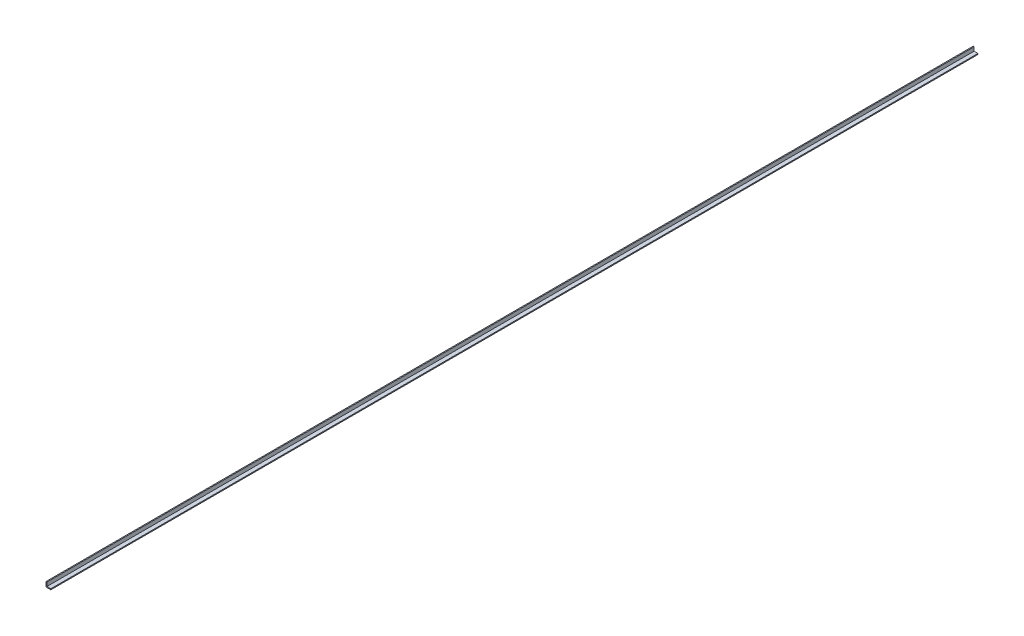
ISO-10303-21;
HEADER;
FILE_DESCRIPTION(('STEP AP214'),'2;1');
FILE_NAME('part.step','',(''),(''),'','','');
FILE_SCHEMA(('AUTOMOTIVE_DESIGN { 1 0 10303 214 1 1 1 1 }'));
ENDSEC;
DATA;
#1=APPLICATION_CONTEXT('core data for automotive mechanical design processes');
#2=APPLICATION_PROTOCOL_DEFINITION('international standard','automotive_design',2000,#1);
#3=PRODUCT_CONTEXT('',#1,'mechanical');
#4=PRODUCT('Part','Part','',(#3));
#5=PRODUCT_RELATED_PRODUCT_CATEGORY('part','',(#4));
#6=PRODUCT_DEFINITION_FORMATION('','',#4);
#7=PRODUCT_DEFINITION_CONTEXT('part definition',#1,'design');
#8=PRODUCT_DEFINITION('design','',#6,#7);
#9=PRODUCT_DEFINITION_SHAPE('','',#8);
#10=(LENGTH_UNIT() NAMED_UNIT(*) SI_UNIT(.MILLI.,.METRE.));
#11=(NAMED_UNIT(*) PLANE_ANGLE_UNIT() SI_UNIT($,.RADIAN.));
#12=(NAMED_UNIT(*) SI_UNIT($,.STERADIAN.) SOLID_ANGLE_UNIT());
#13=UNCERTAINTY_MEASURE_WITH_UNIT(LENGTH_MEASURE(1.E-05),#10,'distance_accuracy_value','');
#14=(GEOMETRIC_REPRESENTATION_CONTEXT(3) GLOBAL_UNCERTAINTY_ASSIGNED_CONTEXT((#13)) GLOBAL_UNIT_ASSIGNED_CONTEXT((#10,
#11,#12)) REPRESENTATION_CONTEXT('',''));
#15=CARTESIAN_POINT('',(0.,0.,0.));
#16=DIRECTION('',(0.,0.,1.));
#17=DIRECTION('',(1.,0.,0.));
#18=AXIS2_PLACEMENT_3D('',#15,#16,#17);
#19=CARTESIAN_POINT('',(6.35,31.75,-6100.));
#20=DIRECTION('',(0.,1.,0.));
#21=DIRECTION('',(0.,0.,1.));
#22=AXIS2_PLACEMENT_3D('',#19,#20,#21);
#23=PLANE('',#22);
#24=DIRECTION('',(-1.,0.,0.));
#25=VECTOR('',#24,1.);
#26=CARTESIAN_POINT('',(6.35,31.75,0.));
#27=LINE('',#26,#25);
#28=CARTESIAN_POINT('',(6.35,31.75,0.));
#29=VERTEX_POINT('',#28);
#30=CARTESIAN_POINT('',(0.,31.75,0.));
#31=VERTEX_POINT('',#30);
#32=EDGE_CURVE('E118',#29,#31,#27,.T.);
#33=ORIENTED_EDGE('',*,*,#32,.F.);
#34=DIRECTION('',(0.,0.,1.));
#35=VECTOR('',#34,1.);
#36=CARTESIAN_POINT('',(6.35,31.75,-6100.));
#37=LINE('',#36,#35);
#38=CARTESIAN_POINT('',(6.35,31.75,-6100.));
#39=VERTEX_POINT('',#38);
#40=EDGE_CURVE('E11',#39,#29,#37,.T.);
#41=ORIENTED_EDGE('',*,*,#40,.F.);
#42=DIRECTION('',(-1.,0.,0.));
#43=VECTOR('',#42,1.);
#44=CARTESIAN_POINT('',(6.35,31.75,-6100.));
#45=LINE('',#44,#43);
#46=CARTESIAN_POINT('',(0.,31.75,-6100.));
#47=VERTEX_POINT('',#46);
#48=EDGE_CURVE('E132',#39,#47,#45,.T.);
#49=ORIENTED_EDGE('',*,*,#48,.T.);
#50=DIRECTION('',(0.,0.,1.));
#51=VECTOR('',#50,1.);
#52=CARTESIAN_POINT('',(0.,31.75,-6100.));
#53=LINE('',#52,#51);
#54=EDGE_CURVE('E36',#47,#31,#53,.T.);
#55=ORIENTED_EDGE('',*,*,#54,.T.);
#56=EDGE_LOOP('',(#33,#41,#49,#55));
#57=FACE_BOUND('',#56,.T.);
#58=ADVANCED_FACE('F33',(#57),#23,.T.);
#59=CARTESIAN_POINT('',(6.35,6.35,-6100.));
#60=DIRECTION('',(1.,0.,0.));
#61=DIRECTION('',(0.,1.,0.));
#62=AXIS2_PLACEMENT_3D('',#59,#60,#61);
#63=PLANE('',#62);
#64=DIRECTION('',(0.,1.,0.));
#65=VECTOR('',#64,1.);
#66=CARTESIAN_POINT('',(6.35,6.35,0.));
#67=LINE('',#66,#65);
#68=CARTESIAN_POINT('',(6.35,6.35,0.));
#69=VERTEX_POINT('',#68);
#70=EDGE_CURVE('E130',#69,#29,#67,.T.);
#71=ORIENTED_EDGE('',*,*,#70,.F.);
#72=DIRECTION('',(0.,0.,1.));
#73=VECTOR('',#72,1.);
#74=CARTESIAN_POINT('',(6.35,6.35,-6100.));
#75=LINE('',#74,#73);
#76=CARTESIAN_POINT('',(6.35,6.35,-6100.));
#77=VERTEX_POINT('',#76);
#78=EDGE_CURVE('E42',#77,#69,#75,.T.);
#79=ORIENTED_EDGE('',*,*,#78,.F.);
#80=DIRECTION('',(0.,1.,0.));
#81=VECTOR('',#80,1.);
#82=CARTESIAN_POINT('',(6.35,6.35,-6100.));
#83=LINE('',#82,#81);
#84=EDGE_CURVE('E108',#77,#39,#83,.T.);
#85=ORIENTED_EDGE('',*,*,#84,.T.);
#86=ORIENTED_EDGE('',*,*,#40,.T.);
#87=EDGE_LOOP('',(#71,#79,#85,#86));
#88=FACE_BOUND('',#87,.T.);
#89=ADVANCED_FACE('F140',(#88),#63,.T.);
#90=CARTESIAN_POINT('',(31.75,6.35,-6100.));
#91=DIRECTION('',(0.,1.,0.));
#92=DIRECTION('',(-1.,0.,0.));
#93=AXIS2_PLACEMENT_3D('',#90,#91,#92);
#94=PLANE('',#93);
#95=DIRECTION('',(-1.,0.,0.));
#96=VECTOR('',#95,1.);
#97=CARTESIAN_POINT('',(31.75,6.35,0.));
#98=LINE('',#97,#96);
#99=CARTESIAN_POINT('',(31.75,6.35,0.));
#100=VERTEX_POINT('',#99);
#101=EDGE_CURVE('E95',#100,#69,#98,.T.);
#102=ORIENTED_EDGE('',*,*,#101,.F.);
#103=DIRECTION('',(0.,0.,1.));
#104=VECTOR('',#103,1.);
#105=CARTESIAN_POINT('',(31.75,6.35,-6100.));
#106=LINE('',#105,#104);
#107=CARTESIAN_POINT('',(31.75,6.35,-6100.));
#108=VERTEX_POINT('',#107);
#109=EDGE_CURVE('E90',#108,#100,#106,.T.);
#110=ORIENTED_EDGE('',*,*,#109,.F.);
#111=DIRECTION('',(-1.,0.,0.));
#112=VECTOR('',#111,1.);
#113=CARTESIAN_POINT('',(31.75,6.35,-6100.));
#114=LINE('',#113,#112);
#115=EDGE_CURVE('E93',#108,#77,#114,.T.);
#116=ORIENTED_EDGE('',*,*,#115,.T.);
#117=ORIENTED_EDGE('',*,*,#78,.T.);
#118=EDGE_LOOP('',(#102,#110,#116,#117));
#119=FACE_BOUND('',#118,.T.);
#120=ADVANCED_FACE('F92',(#119),#94,.T.);
#121=CARTESIAN_POINT('',(31.75,0.,-6100.));
#122=DIRECTION('',(1.,0.,0.));
#123=DIRECTION('',(0.,0.,-1.));
#124=AXIS2_PLACEMENT_3D('',#121,#122,#123);
#125=PLANE('',#124);
#126=DIRECTION('',(0.,1.,0.));
#127=VECTOR('',#126,1.);
#128=CARTESIAN_POINT('',(31.75,0.,0.));
#129=LINE('',#128,#127);
#130=CARTESIAN_POINT('',(31.75,0.,0.));
#131=VERTEX_POINT('',#130);
#132=EDGE_CURVE('E127',#131,#100,#129,.T.);
#133=ORIENTED_EDGE('',*,*,#132,.F.);
#134=DIRECTION('',(0.,0.,1.));
#135=VECTOR('',#134,1.);
#136=CARTESIAN_POINT('',(31.75,0.,-6100.));
#137=LINE('',#136,#135);
#138=CARTESIAN_POINT('',(31.75,0.,-6100.));
#139=VERTEX_POINT('',#138);
#140=EDGE_CURVE('E100',#139,#131,#137,.T.);
#141=ORIENTED_EDGE('',*,*,#140,.F.);
#142=DIRECTION('',(0.,1.,0.));
#143=VECTOR('',#142,1.);
#144=CARTESIAN_POINT('',(31.75,0.,-6100.));
#145=LINE('',#144,#143);
#146=EDGE_CURVE('E106',#139,#108,#145,.T.);
#147=ORIENTED_EDGE('',*,*,#146,.T.);
#148=ORIENTED_EDGE('',*,*,#109,.T.);
#149=EDGE_LOOP('',(#133,#141,#147,#148));
#150=FACE_BOUND('',#149,.T.);
#151=ADVANCED_FACE('F110',(#150),#125,.T.);
#152=CARTESIAN_POINT('',(0.,0.,-6100.));
#153=DIRECTION('',(0.,-1.,0.));
#154=DIRECTION('',(0.,0.,-1.));
#155=AXIS2_PLACEMENT_3D('',#152,#153,#154);
#156=PLANE('',#155);
#157=DIRECTION('',(1.,0.,0.));
#158=VECTOR('',#157,1.);
#159=CARTESIAN_POINT('',(0.,0.,0.));
#160=LINE('',#159,#158);
#161=CARTESIAN_POINT('',(0.,0.,0.));
#162=VERTEX_POINT('',#161);
#163=EDGE_CURVE('E124',#162,#131,#160,.T.);
#164=ORIENTED_EDGE('',*,*,#163,.F.);
#165=DIRECTION('',(0.,0.,1.));
#166=VECTOR('',#165,1.);
#167=CARTESIAN_POINT('',(0.,0.,-6100.));
#168=LINE('',#167,#166);
#169=CARTESIAN_POINT('',(0.,0.,-6100.));
#170=VERTEX_POINT('',#169);
#171=EDGE_CURVE('E135',#170,#162,#168,.T.);
#172=ORIENTED_EDGE('',*,*,#171,.F.);
#173=DIRECTION('',(1.,0.,0.));
#174=VECTOR('',#173,1.);
#175=CARTESIAN_POINT('',(0.,0.,-6100.));
#176=LINE('',#175,#174);
#177=EDGE_CURVE('E111',#170,#139,#176,.T.);
#178=ORIENTED_EDGE('',*,*,#177,.T.);
#179=ORIENTED_EDGE('',*,*,#140,.T.);
#180=EDGE_LOOP('',(#164,#172,#178,#179));
#181=FACE_BOUND('',#180,.T.);
#182=ADVANCED_FACE('F153',(#181),#156,.T.);
#183=CARTESIAN_POINT('',(0.,31.75,-6100.));
#184=DIRECTION('',(-1.,0.,0.));
#185=DIRECTION('',(0.,-1.,0.));
#186=AXIS2_PLACEMENT_3D('',#183,#184,#185);
#187=PLANE('',#186);
#188=DIRECTION('',(0.,-1.,0.));
#189=VECTOR('',#188,1.);
#190=CARTESIAN_POINT('',(0.,31.75,0.));
#191=LINE('',#190,#189);
#192=EDGE_CURVE('E121',#31,#162,#191,.T.);
#193=ORIENTED_EDGE('',*,*,#192,.F.);
#194=ORIENTED_EDGE('',*,*,#54,.F.);
#195=DIRECTION('',(0.,-1.,0.));
#196=VECTOR('',#195,1.);
#197=CARTESIAN_POINT('',(0.,31.75,-6100.));
#198=LINE('',#197,#196);
#199=EDGE_CURVE('E113',#47,#170,#198,.T.);
#200=ORIENTED_EDGE('',*,*,#199,.T.);
#201=ORIENTED_EDGE('',*,*,#171,.T.);
#202=EDGE_LOOP('',(#193,#194,#200,#201));
#203=FACE_BOUND('',#202,.T.);
#204=ADVANCED_FACE('F137',(#203),#187,.T.);
#205=CARTESIAN_POINT('',(0.,0.,-6100.));
#206=DIRECTION('',(0.,0.,1.));
#207=DIRECTION('',(1.,0.,0.));
#208=AXIS2_PLACEMENT_3D('',#205,#206,#207);
#209=PLANE('',#208);
#210=ORIENTED_EDGE('',*,*,#48,.F.);
#211=ORIENTED_EDGE('',*,*,#84,.F.);
#212=ORIENTED_EDGE('',*,*,#115,.F.);
#213=ORIENTED_EDGE('',*,*,#146,.F.);
#214=ORIENTED_EDGE('',*,*,#177,.F.);
#215=ORIENTED_EDGE('',*,*,#199,.F.);
#216=EDGE_LOOP('',(#210,#211,#212,#213,#214,#215));
#217=FACE_BOUND('',#216,.T.);
#218=ADVANCED_FACE('F104',(#217),#209,.F.);
#219=CARTESIAN_POINT('',(0.,0.,0.));
#220=DIRECTION('',(0.,0.,1.));
#221=DIRECTION('',(1.,0.,0.));
#222=AXIS2_PLACEMENT_3D('',#219,#220,#221);
#223=PLANE('',#222);
#224=ORIENTED_EDGE('',*,*,#32,.T.);
#225=ORIENTED_EDGE('',*,*,#192,.T.);
#226=ORIENTED_EDGE('',*,*,#163,.T.);
#227=ORIENTED_EDGE('',*,*,#132,.T.);
#228=ORIENTED_EDGE('',*,*,#101,.T.);
#229=ORIENTED_EDGE('',*,*,#70,.T.);
#230=EDGE_LOOP('',(#224,#225,#226,#227,#228,#229));
#231=FACE_BOUND('',#230,.T.);
#232=ADVANCED_FACE('F139',(#231),#223,.T.);
#233=CLOSED_SHELL('',(#58,#89,#120,#151,#182,#204,#218,#232));
#234=MANIFOLD_SOLID_BREP('B2',#233);
#235=ADVANCED_BREP_SHAPE_REPRESENTATION('',(#18,#234),#14);
#236=SHAPE_DEFINITION_REPRESENTATION(#9,#235);
ENDSEC;
END-ISO-10303-21;
